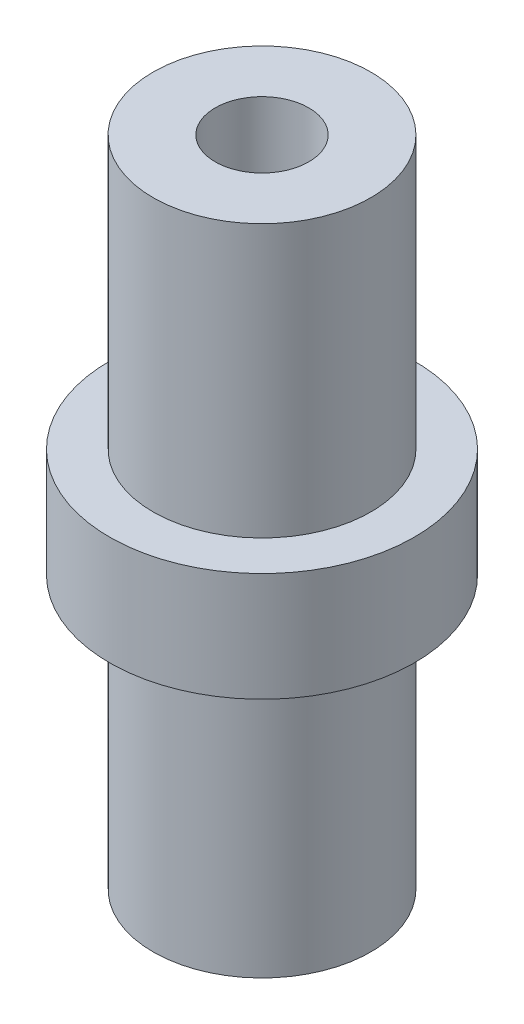
ISO-10303-21;
HEADER;
FILE_DESCRIPTION(('STEP AP214'),'2;1');
FILE_NAME('part.step','',(''),(''),'','','');
FILE_SCHEMA(('AUTOMOTIVE_DESIGN { 1 0 10303 214 1 1 1 1 }'));
ENDSEC;
DATA;
#1=APPLICATION_CONTEXT('core data for automotive mechanical design processes');
#2=APPLICATION_PROTOCOL_DEFINITION('international standard','automotive_design',2000,#1);
#3=PRODUCT_CONTEXT('',#1,'mechanical');
#4=PRODUCT('Part','Part','',(#3));
#5=PRODUCT_RELATED_PRODUCT_CATEGORY('part','',(#4));
#6=PRODUCT_DEFINITION_FORMATION('','',#4);
#7=PRODUCT_DEFINITION_CONTEXT('part definition',#1,'design');
#8=PRODUCT_DEFINITION('design','',#6,#7);
#9=PRODUCT_DEFINITION_SHAPE('','',#8);
#10=(LENGTH_UNIT() NAMED_UNIT(*) SI_UNIT(.MILLI.,.METRE.));
#11=(NAMED_UNIT(*) PLANE_ANGLE_UNIT() SI_UNIT($,.RADIAN.));
#12=(NAMED_UNIT(*) SI_UNIT($,.STERADIAN.) SOLID_ANGLE_UNIT());
#13=UNCERTAINTY_MEASURE_WITH_UNIT(LENGTH_MEASURE(1.E-05),#10,'distance_accuracy_value','');
#14=(GEOMETRIC_REPRESENTATION_CONTEXT(3) GLOBAL_UNCERTAINTY_ASSIGNED_CONTEXT((#13)) GLOBAL_UNIT_ASSIGNED_CONTEXT((#10,
#11,#12)) REPRESENTATION_CONTEXT('',''));
#15=CARTESIAN_POINT('',(0.,0.,0.));
#16=DIRECTION('',(0.,0.,1.));
#17=DIRECTION('',(1.,0.,0.));
#18=AXIS2_PLACEMENT_3D('',#15,#16,#17);
#19=CARTESIAN_POINT('',(-42.6999999999999,2.5,-73.9585694831911));
#20=DIRECTION('',(0.,-1.,0.));
#21=DIRECTION('',(0.86602540378444,0.,-0.499999999999998));
#22=AXIS2_PLACEMENT_3D('',#19,#20,#21);
#23=CYLINDRICAL_SURFACE('',#22,7.);
#24=CARTESIAN_POINT('',(-42.6999999999999,2.5,-73.9585694831911));
#25=DIRECTION('',(0.,1.,0.));
#26=DIRECTION('',(-0.86602540378444,0.,0.499999999999998));
#27=AXIS2_PLACEMENT_3D('',#24,#25,#26);
#28=CIRCLE('',#27,7.);
#29=CARTESIAN_POINT('',(-48.7621778264909,2.5,-70.4585694831912));
#30=VERTEX_POINT('',#29);
#31=EDGE_CURVE('E45',#30,#30,#28,.T.);
#32=ORIENTED_EDGE('',*,*,#31,.F.);
#33=EDGE_LOOP('',(#32));
#34=FACE_BOUND('',#33,.T.);
#35=CARTESIAN_POINT('',(-42.6999999999999,-2.5,-73.9585694831911));
#36=DIRECTION('',(0.,1.,0.));
#37=DIRECTION('',(-0.86602540378444,0.,0.499999999999998));
#38=AXIS2_PLACEMENT_3D('',#35,#36,#37);
#39=CIRCLE('',#38,7.);
#40=CARTESIAN_POINT('',(-48.7621778264909,-2.5,-70.4585694831912));
#41=VERTEX_POINT('',#40);
#42=EDGE_CURVE('E49',#41,#41,#39,.T.);
#43=ORIENTED_EDGE('',*,*,#42,.T.);
#44=EDGE_LOOP('',(#43));
#45=FACE_BOUND('',#44,.T.);
#46=ADVANCED_FACE('F39',(#34,#45),#23,.T.);
#47=CARTESIAN_POINT('',(-42.6999999999999,2.5,-73.9585694831911));
#48=DIRECTION('',(0.,1.,0.));
#49=DIRECTION('',(-0.86602540378444,0.,0.499999999999998));
#50=AXIS2_PLACEMENT_3D('',#47,#48,#49);
#51=PLANE('',#50);
#52=CARTESIAN_POINT('',(-42.6999999999999,2.5,-73.9585694831911));
#53=DIRECTION('',(0.,1.,0.));
#54=DIRECTION('',(-0.86602540378444,0.,0.499999999999998));
#55=AXIS2_PLACEMENT_3D('',#52,#53,#54);
#56=CIRCLE('',#55,5.);
#57=CARTESIAN_POINT('',(-47.0301270189221,2.5,-71.4585694831912));
#58=VERTEX_POINT('',#57);
#59=EDGE_CURVE('E54',#58,#58,#56,.F.);
#60=ORIENTED_EDGE('',*,*,#59,.T.);
#61=EDGE_LOOP('',(#60));
#62=FACE_BOUND('',#61,.T.);
#63=ORIENTED_EDGE('',*,*,#31,.T.);
#64=EDGE_LOOP('',(#63));
#65=FACE_BOUND('',#64,.T.);
#66=ADVANCED_FACE('F94',(#62,#65),#51,.T.);
#67=CARTESIAN_POINT('',(-42.6999999999999,-2.5,-73.9585694831911));
#68=DIRECTION('',(0.,1.,0.));
#69=DIRECTION('',(-0.86602540378444,0.,0.499999999999998));
#70=AXIS2_PLACEMENT_3D('',#67,#68,#69);
#71=PLANE('',#70);
#72=CARTESIAN_POINT('',(-42.6999999999999,-2.5,-73.9585694831911));
#73=DIRECTION('',(0.,1.,0.));
#74=DIRECTION('',(-0.86602540378444,0.,0.499999999999998));
#75=AXIS2_PLACEMENT_3D('',#72,#73,#74);
#76=CIRCLE('',#75,5.);
#77=CARTESIAN_POINT('',(-47.0301270189221,-2.5,-71.4585694831912));
#78=VERTEX_POINT('',#77);
#79=EDGE_CURVE('E10',#78,#78,#76,.F.);
#80=ORIENTED_EDGE('',*,*,#79,.F.);
#81=EDGE_LOOP('',(#80));
#82=FACE_BOUND('',#81,.T.);
#83=ORIENTED_EDGE('',*,*,#42,.F.);
#84=EDGE_LOOP('',(#83));
#85=FACE_BOUND('',#84,.T.);
#86=ADVANCED_FACE('F99',(#82,#85),#71,.F.);
#87=CARTESIAN_POINT('',(-42.6999999999999,-15.,-73.9585694831911));
#88=DIRECTION('',(0.,1.,0.));
#89=DIRECTION('',(-0.86602540378444,0.,0.499999999999998));
#90=AXIS2_PLACEMENT_3D('',#87,#88,#89);
#91=PLANE('',#90);
#92=CARTESIAN_POINT('',(-42.6999999999999,-15.,-73.9585694831911));
#93=DIRECTION('',(0.,1.,0.));
#94=DIRECTION('',(-0.86602540378444,0.,0.499999999999998));
#95=AXIS2_PLACEMENT_3D('',#92,#93,#94);
#96=CIRCLE('',#95,2.15);
#97=CARTESIAN_POINT('',(-44.5619546181364,-15.,-72.8835694831912));
#98=VERTEX_POINT('',#97);
#99=EDGE_CURVE('E62',#98,#98,#96,.T.);
#100=ORIENTED_EDGE('',*,*,#99,.T.);
#101=EDGE_LOOP('',(#100));
#102=FACE_BOUND('',#101,.T.);
#103=CARTESIAN_POINT('',(-42.6999999999999,-15.,-73.9585694831911));
#104=DIRECTION('',(0.,1.,0.));
#105=DIRECTION('',(-0.86602540378444,0.,0.499999999999998));
#106=AXIS2_PLACEMENT_3D('',#103,#104,#105);
#107=CIRCLE('',#106,5.);
#108=CARTESIAN_POINT('',(-47.0301270189221,-15.,-71.4585694831912));
#109=VERTEX_POINT('',#108);
#110=EDGE_CURVE('E59',#109,#109,#107,.T.);
#111=ORIENTED_EDGE('',*,*,#110,.F.);
#112=EDGE_LOOP('',(#111));
#113=FACE_BOUND('',#112,.T.);
#114=ADVANCED_FACE('F88',(#102,#113),#91,.F.);
#115=CARTESIAN_POINT('',(-42.6999999999999,15.,-73.9585694831911));
#116=DIRECTION('',(0.,-1.,0.));
#117=DIRECTION('',(0.86602540378444,0.,-0.499999999999998));
#118=AXIS2_PLACEMENT_3D('',#115,#116,#117);
#119=CYLINDRICAL_SURFACE('',#118,5.);
#120=ORIENTED_EDGE('',*,*,#110,.T.);
#121=EDGE_LOOP('',(#120));
#122=FACE_BOUND('',#121,.T.);
#123=ORIENTED_EDGE('',*,*,#79,.T.);
#124=EDGE_LOOP('',(#123));
#125=FACE_BOUND('',#124,.T.);
#126=ADVANCED_FACE('F82',(#122,#125),#119,.T.);
#127=ORIENTED_EDGE('',*,*,#59,.F.);
#128=EDGE_LOOP('',(#127));
#129=FACE_BOUND('',#128,.T.);
#130=CARTESIAN_POINT('',(-42.6999999999999,15.,-73.9585694831911));
#131=DIRECTION('',(0.,1.,0.));
#132=DIRECTION('',(-0.86602540378444,0.,0.499999999999998));
#133=AXIS2_PLACEMENT_3D('',#130,#131,#132);
#134=CIRCLE('',#133,5.);
#135=CARTESIAN_POINT('',(-47.0301270189221,15.,-71.4585694831912));
#136=VERTEX_POINT('',#135);
#137=EDGE_CURVE('E58',#136,#136,#134,.T.);
#138=ORIENTED_EDGE('',*,*,#137,.F.);
#139=EDGE_LOOP('',(#138));
#140=FACE_BOUND('',#139,.T.);
#141=ADVANCED_FACE('F77',(#129,#140),#119,.T.);
#142=CARTESIAN_POINT('',(-42.6999999999999,15.,-73.9585694831911));
#143=DIRECTION('',(0.,1.,0.));
#144=DIRECTION('',(-0.86602540378444,0.,0.499999999999998));
#145=AXIS2_PLACEMENT_3D('',#142,#143,#144);
#146=PLANE('',#145);
#147=CARTESIAN_POINT('',(-42.6999999999999,15.,-73.9585694831911));
#148=DIRECTION('',(0.,1.,0.));
#149=DIRECTION('',(-0.86602540378444,0.,0.499999999999998));
#150=AXIS2_PLACEMENT_3D('',#147,#148,#149);
#151=CIRCLE('',#150,2.15);
#152=CARTESIAN_POINT('',(-44.5619546181364,15.,-72.8835694831912));
#153=VERTEX_POINT('',#152);
#154=EDGE_CURVE('E67',#153,#153,#151,.T.);
#155=ORIENTED_EDGE('',*,*,#154,.F.);
#156=EDGE_LOOP('',(#155));
#157=FACE_BOUND('',#156,.T.);
#158=ORIENTED_EDGE('',*,*,#137,.T.);
#159=EDGE_LOOP('',(#158));
#160=FACE_BOUND('',#159,.T.);
#161=ADVANCED_FACE('F74',(#157,#160),#146,.T.);
#162=CARTESIAN_POINT('',(-42.6999999999999,-16.5,-73.9585694831911));
#163=DIRECTION('',(0.,1.,0.));
#164=DIRECTION('',(-0.86602540378444,0.,0.499999999999998));
#165=AXIS2_PLACEMENT_3D('',#162,#163,#164);
#166=CYLINDRICAL_SURFACE('',#165,2.15);
#167=ORIENTED_EDGE('',*,*,#154,.T.);
#168=EDGE_LOOP('',(#167));
#169=FACE_BOUND('',#168,.T.);
#170=ORIENTED_EDGE('',*,*,#99,.F.);
#171=EDGE_LOOP('',(#170));
#172=FACE_BOUND('',#171,.T.);
#173=ADVANCED_FACE('F71',(#169,#172),#166,.F.);
#174=CLOSED_SHELL('',(#46,#66,#86,#114,#126,#141,#161,#173));
#175=MANIFOLD_SOLID_BREP('B2',#174);
#176=ADVANCED_BREP_SHAPE_REPRESENTATION('',(#18,#175),#14);
#177=SHAPE_DEFINITION_REPRESENTATION(#9,#176);
ENDSEC;
END-ISO-10303-21;
